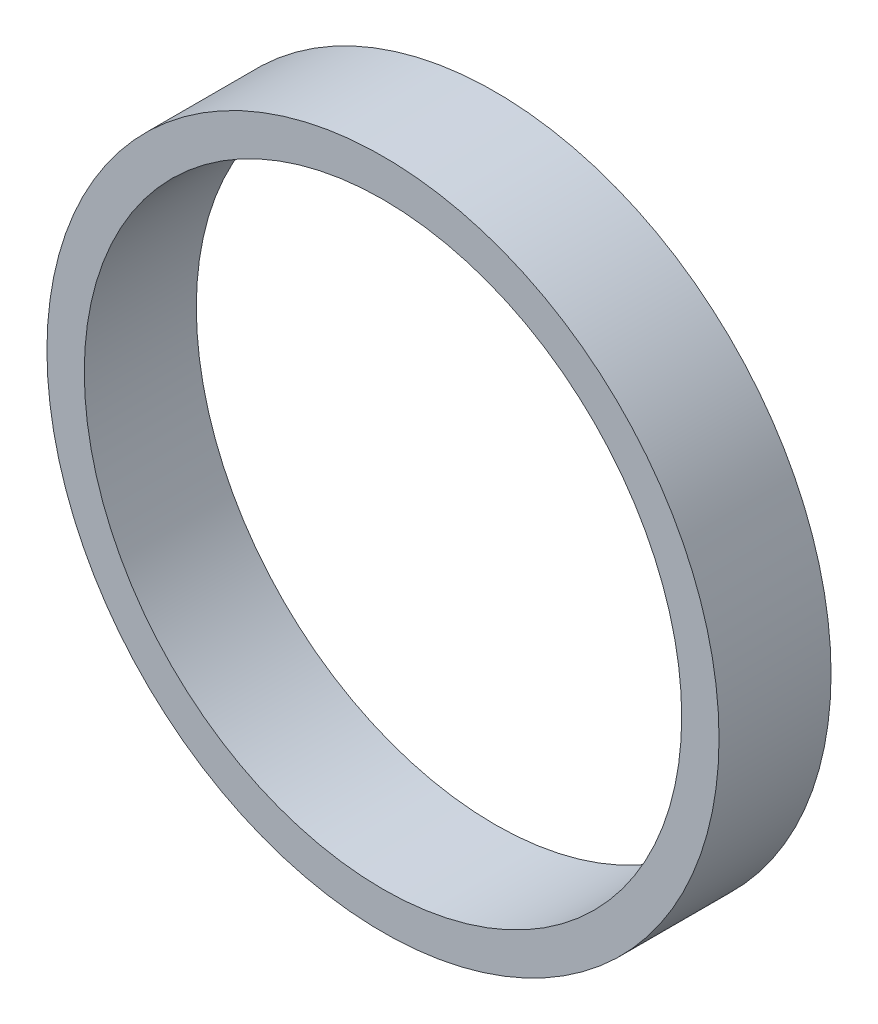
ISO-10303-21;
HEADER;
FILE_DESCRIPTION(('STEP AP214'),'2;1');
FILE_NAME('part.step','',(''),(''),'','','');
FILE_SCHEMA(('AUTOMOTIVE_DESIGN { 1 0 10303 214 1 1 1 1 }'));
ENDSEC;
DATA;
#1=APPLICATION_CONTEXT('core data for automotive mechanical design processes');
#2=APPLICATION_PROTOCOL_DEFINITION('international standard','automotive_design',2000,#1);
#3=PRODUCT_CONTEXT('',#1,'mechanical');
#4=PRODUCT('Part','Part','',(#3));
#5=PRODUCT_RELATED_PRODUCT_CATEGORY('part','',(#4));
#6=PRODUCT_DEFINITION_FORMATION('','',#4);
#7=PRODUCT_DEFINITION_CONTEXT('part definition',#1,'design');
#8=PRODUCT_DEFINITION('design','',#6,#7);
#9=PRODUCT_DEFINITION_SHAPE('','',#8);
#10=(LENGTH_UNIT() NAMED_UNIT(*) SI_UNIT(.MILLI.,.METRE.));
#11=(NAMED_UNIT(*) PLANE_ANGLE_UNIT() SI_UNIT($,.RADIAN.));
#12=(NAMED_UNIT(*) SI_UNIT($,.STERADIAN.) SOLID_ANGLE_UNIT());
#13=UNCERTAINTY_MEASURE_WITH_UNIT(LENGTH_MEASURE(1.E-05),#10,'distance_accuracy_value','');
#14=(GEOMETRIC_REPRESENTATION_CONTEXT(3) GLOBAL_UNCERTAINTY_ASSIGNED_CONTEXT((#13)) GLOBAL_UNIT_ASSIGNED_CONTEXT((#10,
#11,#12)) REPRESENTATION_CONTEXT('',''));
#15=CARTESIAN_POINT('',(0.,0.,0.));
#16=DIRECTION('',(0.,0.,1.));
#17=DIRECTION('',(1.,0.,0.));
#18=AXIS2_PLACEMENT_3D('',#15,#16,#17);
#19=CARTESIAN_POINT('',(0.,0.,0.));
#20=DIRECTION('',(0.,0.,1.));
#21=DIRECTION('',(1.,0.,0.));
#22=AXIS2_PLACEMENT_3D('',#19,#20,#21);
#23=PLANE('',#22);
#24=CARTESIAN_POINT('',(0.,0.,0.));
#25=DIRECTION('',(0.,0.,1.));
#26=DIRECTION('',(1.,0.,0.));
#27=AXIS2_PLACEMENT_3D('',#24,#25,#26);
#28=CIRCLE('',#27,18.);
#29=CARTESIAN_POINT('',(18.,0.,0.));
#30=VERTEX_POINT('',#29);
#31=EDGE_CURVE('E11',#30,#30,#28,.T.);
#32=ORIENTED_EDGE('',*,*,#31,.F.);
#33=EDGE_LOOP('',(#32));
#34=FACE_BOUND('',#33,.T.);
#35=CARTESIAN_POINT('',(0.,0.,0.));
#36=DIRECTION('',(0.,0.,1.));
#37=DIRECTION('',(1.,0.,0.));
#38=AXIS2_PLACEMENT_3D('',#35,#36,#37);
#39=CIRCLE('',#38,16.);
#40=CARTESIAN_POINT('',(16.,0.,0.));
#41=VERTEX_POINT('',#40);
#42=EDGE_CURVE('E54',#41,#41,#39,.T.);
#43=ORIENTED_EDGE('',*,*,#42,.T.);
#44=EDGE_LOOP('',(#43));
#45=FACE_BOUND('',#44,.T.);
#46=ADVANCED_FACE('F17',(#34,#45),#23,.F.);
#47=CARTESIAN_POINT('',(0.,0.,6.));
#48=DIRECTION('',(0.,0.,1.));
#49=DIRECTION('',(1.,0.,0.));
#50=AXIS2_PLACEMENT_3D('',#47,#48,#49);
#51=PLANE('',#50);
#52=CARTESIAN_POINT('',(0.,0.,6.));
#53=DIRECTION('',(0.,0.,1.));
#54=DIRECTION('',(1.,0.,0.));
#55=AXIS2_PLACEMENT_3D('',#52,#53,#54);
#56=CIRCLE('',#55,18.);
#57=CARTESIAN_POINT('',(18.,0.,6.));
#58=VERTEX_POINT('',#57);
#59=EDGE_CURVE('E20',#58,#58,#56,.T.);
#60=ORIENTED_EDGE('',*,*,#59,.T.);
#61=EDGE_LOOP('',(#60));
#62=FACE_BOUND('',#61,.T.);
#63=CARTESIAN_POINT('',(0.,0.,6.));
#64=DIRECTION('',(0.,0.,1.));
#65=DIRECTION('',(1.,0.,0.));
#66=AXIS2_PLACEMENT_3D('',#63,#64,#65);
#67=CIRCLE('',#66,16.);
#68=CARTESIAN_POINT('',(16.,0.,6.));
#69=VERTEX_POINT('',#68);
#70=EDGE_CURVE('E50',#69,#69,#67,.T.);
#71=ORIENTED_EDGE('',*,*,#70,.F.);
#72=EDGE_LOOP('',(#71));
#73=FACE_BOUND('',#72,.T.);
#74=ADVANCED_FACE('F90',(#62,#73),#51,.T.);
#75=CARTESIAN_POINT('',(0.,0.,6.));
#76=DIRECTION('',(0.,0.,-1.));
#77=DIRECTION('',(-1.,0.,0.));
#78=AXIS2_PLACEMENT_3D('',#75,#76,#77);
#79=CYLINDRICAL_SURFACE('',#78,18.);
#80=ORIENTED_EDGE('',*,*,#31,.T.);
#81=EDGE_LOOP('',(#80));
#82=FACE_BOUND('',#81,.T.);
#83=ORIENTED_EDGE('',*,*,#59,.F.);
#84=EDGE_LOOP('',(#83));
#85=FACE_BOUND('',#84,.T.);
#86=ADVANCED_FACE('F79',(#82,#85),#79,.T.);
#87=CARTESIAN_POINT('',(0.,0.,6.));
#88=DIRECTION('',(0.,0.,-1.));
#89=DIRECTION('',(-1.,0.,0.));
#90=AXIS2_PLACEMENT_3D('',#87,#88,#89);
#91=CYLINDRICAL_SURFACE('',#90,16.);
#92=ORIENTED_EDGE('',*,*,#42,.F.);
#93=EDGE_LOOP('',(#92));
#94=FACE_BOUND('',#93,.T.);
#95=ORIENTED_EDGE('',*,*,#70,.T.);
#96=EDGE_LOOP('',(#95));
#97=FACE_BOUND('',#96,.T.);
#98=ADVANCED_FACE('F51',(#94,#97),#91,.F.);
#99=CLOSED_SHELL('',(#46,#74,#86,#98));
#100=MANIFOLD_SOLID_BREP('B1',#99);
#101=ADVANCED_BREP_SHAPE_REPRESENTATION('',(#18,#100),#14);
#102=SHAPE_DEFINITION_REPRESENTATION(#9,#101);
ENDSEC;
END-ISO-10303-21;
